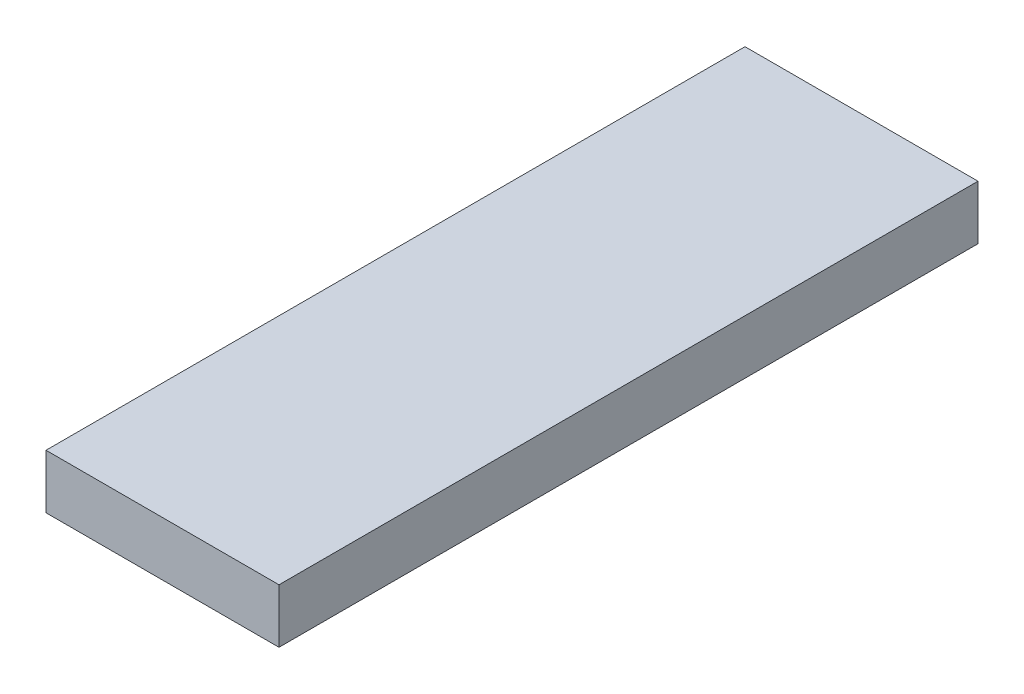
ISO-10303-21;
HEADER;
FILE_DESCRIPTION(('STEP AP214'),'2;1');
FILE_NAME('part.step','',(''),(''),'','','');
FILE_SCHEMA(('AUTOMOTIVE_DESIGN { 1 0 10303 214 1 1 1 1 }'));
ENDSEC;
DATA;
#1=APPLICATION_CONTEXT('core data for automotive mechanical design processes');
#2=APPLICATION_PROTOCOL_DEFINITION('international standard','automotive_design',2000,#1);
#3=PRODUCT_CONTEXT('',#1,'mechanical');
#4=PRODUCT('Part','Part','',(#3));
#5=PRODUCT_RELATED_PRODUCT_CATEGORY('part','',(#4));
#6=PRODUCT_DEFINITION_FORMATION('','',#4);
#7=PRODUCT_DEFINITION_CONTEXT('part definition',#1,'design');
#8=PRODUCT_DEFINITION('design','',#6,#7);
#9=PRODUCT_DEFINITION_SHAPE('','',#8);
#10=(LENGTH_UNIT() NAMED_UNIT(*) SI_UNIT(.MILLI.,.METRE.));
#11=(NAMED_UNIT(*) PLANE_ANGLE_UNIT() SI_UNIT($,.RADIAN.));
#12=(NAMED_UNIT(*) SI_UNIT($,.STERADIAN.) SOLID_ANGLE_UNIT());
#13=UNCERTAINTY_MEASURE_WITH_UNIT(LENGTH_MEASURE(1.E-05),#10,'distance_accuracy_value','');
#14=(GEOMETRIC_REPRESENTATION_CONTEXT(3) GLOBAL_UNCERTAINTY_ASSIGNED_CONTEXT((#13)) GLOBAL_UNIT_ASSIGNED_CONTEXT((#10,
#11,#12)) REPRESENTATION_CONTEXT('',''));
#15=CARTESIAN_POINT('',(0.,0.,0.));
#16=DIRECTION('',(0.,0.,1.));
#17=DIRECTION('',(1.,0.,0.));
#18=AXIS2_PLACEMENT_3D('',#15,#16,#17);
#19=CARTESIAN_POINT('',(-172.498914238737,11.81,-1294.42310728357));
#20=DIRECTION('',(-1.,0.,0.));
#21=DIRECTION('',(0.,0.,1.));
#22=AXIS2_PLACEMENT_3D('',#19,#20,#21);
#23=PLANE('',#22);
#24=DIRECTION('',(0.,0.,-1.));
#25=VECTOR('',#24,1.);
#26=CARTESIAN_POINT('',(-172.498914238737,0.,-1294.42310728357));
#27=LINE('',#26,#25);
#28=CARTESIAN_POINT('',(-172.498914238737,0.,-1142.02310728357));
#29=VERTEX_POINT('',#28);
#30=CARTESIAN_POINT('',(-172.498914238737,0.,-1294.42310728357));
#31=VERTEX_POINT('',#30);
#32=EDGE_CURVE('E97',#29,#31,#27,.T.);
#33=ORIENTED_EDGE('',*,*,#32,.T.);
#34=DIRECTION('',(0.,-1.,0.));
#35=VECTOR('',#34,1.);
#36=CARTESIAN_POINT('',(-172.498914238737,11.81,-1294.42310728357));
#37=LINE('',#36,#35);
#38=CARTESIAN_POINT('',(-172.498914238737,11.81,-1294.42310728357));
#39=VERTEX_POINT('',#38);
#40=EDGE_CURVE('E11',#39,#31,#37,.T.);
#41=ORIENTED_EDGE('',*,*,#40,.F.);
#42=DIRECTION('',(0.,0.,-1.));
#43=VECTOR('',#42,1.);
#44=CARTESIAN_POINT('',(-172.498914238737,11.81,-1294.42310728357));
#45=LINE('',#44,#43);
#46=CARTESIAN_POINT('',(-172.498914238737,11.81,-1142.02310728357));
#47=VERTEX_POINT('',#46);
#48=EDGE_CURVE('E85',#47,#39,#45,.T.);
#49=ORIENTED_EDGE('',*,*,#48,.F.);
#50=DIRECTION('',(0.,-1.,0.));
#51=VECTOR('',#50,1.);
#52=CARTESIAN_POINT('',(-172.498914238737,11.81,-1142.02310728357));
#53=LINE('',#52,#51);
#54=EDGE_CURVE('E93',#47,#29,#53,.T.);
#55=ORIENTED_EDGE('',*,*,#54,.T.);
#56=EDGE_LOOP('',(#33,#41,#49,#55));
#57=FACE_BOUND('',#56,.T.);
#58=ADVANCED_FACE('F34',(#57),#23,.F.);
#59=CARTESIAN_POINT('',(-223.298914238737,11.81,-1294.42310728357));
#60=DIRECTION('',(0.,0.,1.));
#61=DIRECTION('',(1.,0.,0.));
#62=AXIS2_PLACEMENT_3D('',#59,#60,#61);
#63=PLANE('',#62);
#64=DIRECTION('',(-1.,0.,0.));
#65=VECTOR('',#64,1.);
#66=CARTESIAN_POINT('',(-223.298914238737,0.,-1294.42310728357));
#67=LINE('',#66,#65);
#68=CARTESIAN_POINT('',(-223.298914238737,0.,-1294.42310728357));
#69=VERTEX_POINT('',#68);
#70=EDGE_CURVE('E89',#31,#69,#67,.T.);
#71=ORIENTED_EDGE('',*,*,#70,.T.);
#72=DIRECTION('',(0.,-1.,0.));
#73=VECTOR('',#72,1.);
#74=CARTESIAN_POINT('',(-223.298914238737,11.81,-1294.42310728357));
#75=LINE('',#74,#73);
#76=CARTESIAN_POINT('',(-223.298914238737,11.81,-1294.42310728357));
#77=VERTEX_POINT('',#76);
#78=EDGE_CURVE('E42',#77,#69,#75,.T.);
#79=ORIENTED_EDGE('',*,*,#78,.F.);
#80=DIRECTION('',(-1.,0.,0.));
#81=VECTOR('',#80,1.);
#82=CARTESIAN_POINT('',(-223.298914238737,11.81,-1294.42310728357));
#83=LINE('',#82,#81);
#84=EDGE_CURVE('E80',#39,#77,#83,.T.);
#85=ORIENTED_EDGE('',*,*,#84,.F.);
#86=ORIENTED_EDGE('',*,*,#40,.T.);
#87=EDGE_LOOP('',(#71,#79,#85,#86));
#88=FACE_BOUND('',#87,.T.);
#89=ADVANCED_FACE('F88',(#88),#63,.F.);
#90=CARTESIAN_POINT('',(-223.298914238737,11.81,-1294.42310728357));
#91=DIRECTION('',(1.,0.,0.));
#92=DIRECTION('',(0.,0.,-1.));
#93=AXIS2_PLACEMENT_3D('',#90,#91,#92);
#94=PLANE('',#93);
#95=DIRECTION('',(0.,0.,1.));
#96=VECTOR('',#95,1.);
#97=CARTESIAN_POINT('',(-223.298914238737,0.,-1294.42310728357));
#98=LINE('',#97,#96);
#99=CARTESIAN_POINT('',(-223.298914238737,0.,-1142.02310728357));
#100=VERTEX_POINT('',#99);
#101=EDGE_CURVE('E67',#69,#100,#98,.T.);
#102=ORIENTED_EDGE('',*,*,#101,.T.);
#103=DIRECTION('',(0.,-1.,0.));
#104=VECTOR('',#103,1.);
#105=CARTESIAN_POINT('',(-223.298914238737,11.81,-1142.02310728357));
#106=LINE('',#105,#104);
#107=CARTESIAN_POINT('',(-223.298914238737,11.81,-1142.02310728357));
#108=VERTEX_POINT('',#107);
#109=EDGE_CURVE('E90',#108,#100,#106,.T.);
#110=ORIENTED_EDGE('',*,*,#109,.F.);
#111=DIRECTION('',(0.,0.,1.));
#112=VECTOR('',#111,1.);
#113=CARTESIAN_POINT('',(-223.298914238737,11.81,-1294.42310728357));
#114=LINE('',#113,#112);
#115=EDGE_CURVE('E83',#77,#108,#114,.T.);
#116=ORIENTED_EDGE('',*,*,#115,.F.);
#117=ORIENTED_EDGE('',*,*,#78,.T.);
#118=EDGE_LOOP('',(#102,#110,#116,#117));
#119=FACE_BOUND('',#118,.T.);
#120=ADVANCED_FACE('F91',(#119),#94,.F.);
#121=CARTESIAN_POINT('',(-223.298914238737,11.81,-1142.02310728357));
#122=DIRECTION('',(0.,0.,-1.));
#123=DIRECTION('',(-1.,0.,0.));
#124=AXIS2_PLACEMENT_3D('',#121,#122,#123);
#125=PLANE('',#124);
#126=DIRECTION('',(1.,0.,0.));
#127=VECTOR('',#126,1.);
#128=CARTESIAN_POINT('',(-223.298914238737,0.,-1142.02310728357));
#129=LINE('',#128,#127);
#130=EDGE_CURVE('E73',#100,#29,#129,.T.);
#131=ORIENTED_EDGE('',*,*,#130,.T.);
#132=ORIENTED_EDGE('',*,*,#54,.F.);
#133=DIRECTION('',(1.,0.,0.));
#134=VECTOR('',#133,1.);
#135=CARTESIAN_POINT('',(-223.298914238737,11.81,-1142.02310728357));
#136=LINE('',#135,#134);
#137=EDGE_CURVE('E50',#108,#47,#136,.T.);
#138=ORIENTED_EDGE('',*,*,#137,.F.);
#139=ORIENTED_EDGE('',*,*,#109,.T.);
#140=EDGE_LOOP('',(#131,#132,#138,#139));
#141=FACE_BOUND('',#140,.T.);
#142=ADVANCED_FACE('F104',(#141),#125,.F.);
#143=CARTESIAN_POINT('',(0.,11.81,0.));
#144=DIRECTION('',(0.,1.,0.));
#145=DIRECTION('',(0.,0.,1.));
#146=AXIS2_PLACEMENT_3D('',#143,#144,#145);
#147=PLANE('',#146);
#148=ORIENTED_EDGE('',*,*,#48,.T.);
#149=ORIENTED_EDGE('',*,*,#84,.T.);
#150=ORIENTED_EDGE('',*,*,#115,.T.);
#151=ORIENTED_EDGE('',*,*,#137,.T.);
#152=EDGE_LOOP('',(#148,#149,#150,#151));
#153=FACE_BOUND('',#152,.T.);
#154=ADVANCED_FACE('F81',(#153),#147,.T.);
#155=CARTESIAN_POINT('',(0.,0.,0.));
#156=DIRECTION('',(0.,1.,0.));
#157=DIRECTION('',(0.,0.,1.));
#158=AXIS2_PLACEMENT_3D('',#155,#156,#157);
#159=PLANE('',#158);
#160=ORIENTED_EDGE('',*,*,#32,.F.);
#161=ORIENTED_EDGE('',*,*,#130,.F.);
#162=ORIENTED_EDGE('',*,*,#101,.F.);
#163=ORIENTED_EDGE('',*,*,#70,.F.);
#164=EDGE_LOOP('',(#160,#161,#162,#163));
#165=FACE_BOUND('',#164,.T.);
#166=ADVANCED_FACE('F107',(#165),#159,.F.);
#167=CLOSED_SHELL('',(#58,#89,#120,#142,#154,#166));
#168=MANIFOLD_SOLID_BREP('B2',#167);
#169=ADVANCED_BREP_SHAPE_REPRESENTATION('',(#18,#168),#14);
#170=SHAPE_DEFINITION_REPRESENTATION(#9,#169);
ENDSEC;
END-ISO-10303-21;
